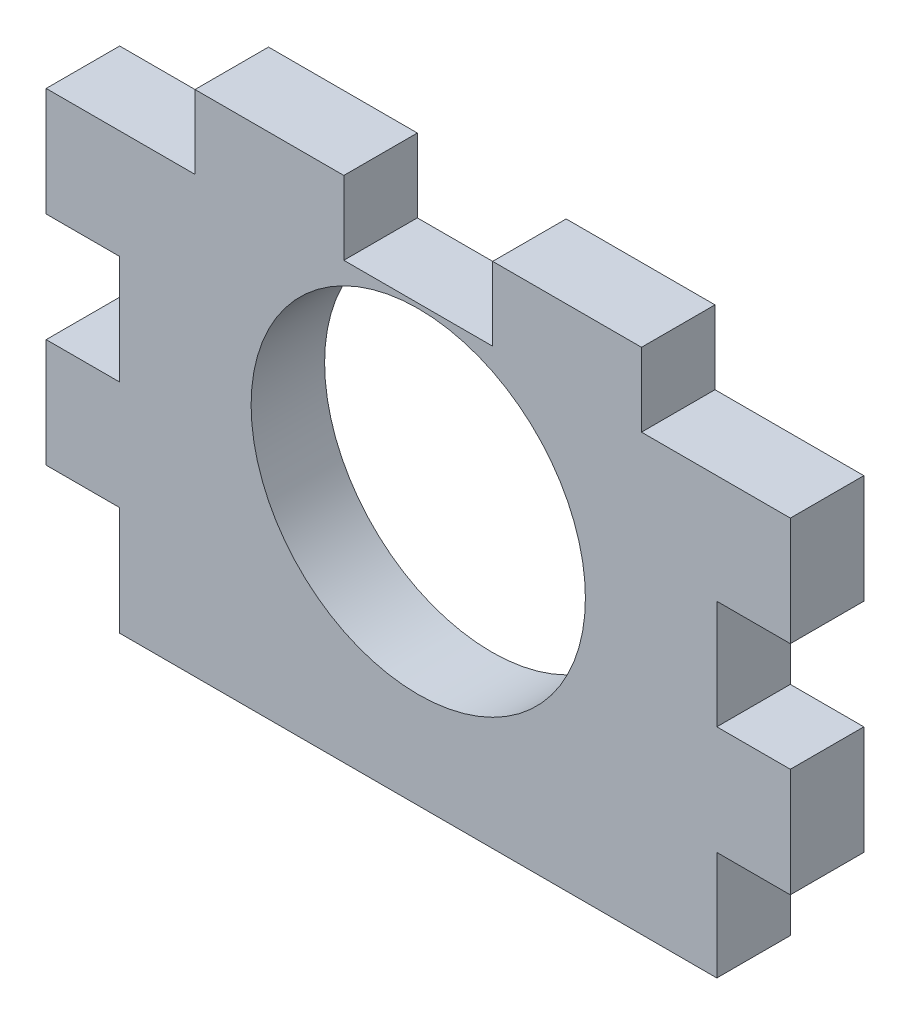
ISO-10303-21;
HEADER;
FILE_DESCRIPTION(('STEP AP214'),'2;1');
FILE_NAME('part.step','',(''),(''),'','','');
FILE_SCHEMA(('AUTOMOTIVE_DESIGN { 1 0 10303 214 1 1 1 1 }'));
ENDSEC;
DATA;
#1=APPLICATION_CONTEXT('core data for automotive mechanical design processes');
#2=APPLICATION_PROTOCOL_DEFINITION('international standard','automotive_design',2000,#1);
#3=PRODUCT_CONTEXT('',#1,'mechanical');
#4=PRODUCT('Part','Part','',(#3));
#5=PRODUCT_RELATED_PRODUCT_CATEGORY('part','',(#4));
#6=PRODUCT_DEFINITION_FORMATION('','',#4);
#7=PRODUCT_DEFINITION_CONTEXT('part definition',#1,'design');
#8=PRODUCT_DEFINITION('design','',#6,#7);
#9=PRODUCT_DEFINITION_SHAPE('','',#8);
#10=(LENGTH_UNIT() NAMED_UNIT(*) SI_UNIT(.MILLI.,.METRE.));
#11=(NAMED_UNIT(*) PLANE_ANGLE_UNIT() SI_UNIT($,.RADIAN.));
#12=(NAMED_UNIT(*) SI_UNIT($,.STERADIAN.) SOLID_ANGLE_UNIT());
#13=UNCERTAINTY_MEASURE_WITH_UNIT(LENGTH_MEASURE(1.E-05),#10,'distance_accuracy_value','');
#14=(GEOMETRIC_REPRESENTATION_CONTEXT(3) GLOBAL_UNCERTAINTY_ASSIGNED_CONTEXT((#13)) GLOBAL_UNIT_ASSIGNED_CONTEXT((#10,
#11,#12)) REPRESENTATION_CONTEXT('',''));
#15=CARTESIAN_POINT('',(0.,0.,0.));
#16=DIRECTION('',(0.,0.,1.));
#17=DIRECTION('',(1.,0.,0.));
#18=AXIS2_PLACEMENT_3D('',#15,#16,#17);
#19=CARTESIAN_POINT('',(-5.53524932452526,14.1108572179902,8.1534));
#20=DIRECTION('',(-1.,0.,0.));
#21=DIRECTION('',(0.,0.,1.));
#22=AXIS2_PLACEMENT_3D('',#19,#20,#21);
#23=PLANE('',#22);
#24=DIRECTION('',(0.,1.,0.));
#25=VECTOR('',#24,1.);
#26=CARTESIAN_POINT('',(-5.53524932452526,14.1108572179902,8.1534));
#27=LINE('',#26,#25);
#28=CARTESIAN_POINT('',(-5.53524932452527,-6.10722193706049,8.1534));
#29=VERTEX_POINT('',#28);
#30=CARTESIAN_POINT('',(-5.53524932452526,5.95745721799016,8.1534));
#31=VERTEX_POINT('',#30);
#32=EDGE_CURVE('E367',#29,#31,#27,.T.);
#33=ORIENTED_EDGE('',*,*,#32,.F.);
#34=DIRECTION('',(0.,0.,1.));
#35=VECTOR('',#34,1.);
#36=CARTESIAN_POINT('',(-5.53524932452527,-6.10722193706049,0.));
#37=LINE('',#36,#35);
#38=CARTESIAN_POINT('',(-5.53524932452527,-6.10722193706049,0.));
#39=VERTEX_POINT('',#38);
#40=EDGE_CURVE('E228',#39,#29,#37,.T.);
#41=ORIENTED_EDGE('',*,*,#40,.F.);
#42=DIRECTION('',(0.,1.,0.));
#43=VECTOR('',#42,1.);
#44=CARTESIAN_POINT('',(-5.53524932452526,14.1108572179902,0.));
#45=LINE('',#44,#43);
#46=CARTESIAN_POINT('',(-5.53524932452526,5.95745721799016,0.));
#47=VERTEX_POINT('',#46);
#48=EDGE_CURVE('E215',#39,#47,#45,.T.);
#49=ORIENTED_EDGE('',*,*,#48,.T.);
#50=DIRECTION('',(0.,0.,1.));
#51=VECTOR('',#50,1.);
#52=CARTESIAN_POINT('',(-5.53524932452526,5.95745721799016,0.));
#53=LINE('',#52,#51);
#54=EDGE_CURVE('E310',#47,#31,#53,.T.);
#55=ORIENTED_EDGE('',*,*,#54,.T.);
#56=EDGE_LOOP('',(#33,#41,#49,#55));
#57=FACE_BOUND('',#56,.T.);
#58=ADVANCED_FACE('F33',(#57),#23,.F.);
#59=CARTESIAN_POINT('',(-88.0852493245253,14.1108572179902,8.1534));
#60=DIRECTION('',(1.,0.,0.));
#61=DIRECTION('',(0.,0.,-1.));
#62=AXIS2_PLACEMENT_3D('',#59,#60,#61);
#63=PLANE('',#62);
#64=DIRECTION('',(0.,-1.,0.));
#65=VECTOR('',#64,1.);
#66=CARTESIAN_POINT('',(-88.0852493245253,14.1108572179902,0.));
#67=LINE('',#66,#65);
#68=CARTESIAN_POINT('',(-88.0852493245253,5.95745721799016,0.));
#69=VERTEX_POINT('',#68);
#70=CARTESIAN_POINT('',(-88.0852493245253,-6.1072219370605,0.));
#71=VERTEX_POINT('',#70);
#72=EDGE_CURVE('E371',#69,#71,#67,.T.);
#73=ORIENTED_EDGE('',*,*,#72,.T.);
#74=DIRECTION('',(0.,0.,1.));
#75=VECTOR('',#74,1.);
#76=CARTESIAN_POINT('',(-88.0852493245253,-6.1072219370605,0.));
#77=LINE('',#76,#75);
#78=CARTESIAN_POINT('',(-88.0852493245253,-6.1072219370605,8.1534));
#79=VERTEX_POINT('',#78);
#80=EDGE_CURVE('E268',#71,#79,#77,.T.);
#81=ORIENTED_EDGE('',*,*,#80,.T.);
#82=DIRECTION('',(0.,-1.,0.));
#83=VECTOR('',#82,1.);
#84=CARTESIAN_POINT('',(-88.0852493245253,14.1108572179902,8.1534));
#85=LINE('',#84,#83);
#86=CARTESIAN_POINT('',(-88.0852493245253,5.95745721799016,8.1534));
#87=VERTEX_POINT('',#86);
#88=EDGE_CURVE('E360',#87,#79,#85,.T.);
#89=ORIENTED_EDGE('',*,*,#88,.F.);
#90=DIRECTION('',(0.,0.,1.));
#91=VECTOR('',#90,1.);
#92=CARTESIAN_POINT('',(-88.0852493245253,5.95745721799016,0.));
#93=LINE('',#92,#91);
#94=EDGE_CURVE('E348',#69,#87,#93,.T.);
#95=ORIENTED_EDGE('',*,*,#94,.F.);
#96=EDGE_LOOP('',(#73,#81,#89,#95));
#97=FACE_BOUND('',#96,.T.);
#98=ADVANCED_FACE('F427',(#97),#63,.F.);
#99=CARTESIAN_POINT('',(-88.0852493245253,14.1108572179902,8.1534));
#100=DIRECTION('',(0.,-1.,0.));
#101=DIRECTION('',(0.,0.,-1.));
#102=AXIS2_PLACEMENT_3D('',#99,#100,#101);
#103=PLANE('',#102);
#104=DIRECTION('',(-1.,0.,0.));
#105=VECTOR('',#104,1.);
#106=CARTESIAN_POINT('',(-88.0852493245253,14.1108572179902,8.1534));
#107=LINE('',#106,#105);
#108=CARTESIAN_POINT('',(-55.0652493245253,14.1108572179902,8.1534));
#109=VERTEX_POINT('',#108);
#110=CARTESIAN_POINT('',(-71.5752493245253,14.1108572179902,8.1534));
#111=VERTEX_POINT('',#110);
#112=EDGE_CURVE('E42',#109,#111,#107,.T.);
#113=ORIENTED_EDGE('',*,*,#112,.F.);
#114=DIRECTION('',(0.,0.,1.));
#115=VECTOR('',#114,1.);
#116=CARTESIAN_POINT('',(-55.0652493245253,14.1108572179902,0.));
#117=LINE('',#116,#115);
#118=CARTESIAN_POINT('',(-55.0652493245253,14.1108572179902,0.));
#119=VERTEX_POINT('',#118);
#120=EDGE_CURVE('E332',#119,#109,#117,.T.);
#121=ORIENTED_EDGE('',*,*,#120,.F.);
#122=DIRECTION('',(-1.,0.,0.));
#123=VECTOR('',#122,1.);
#124=CARTESIAN_POINT('',(-88.0852493245253,14.1108572179902,0.));
#125=LINE('',#124,#123);
#126=CARTESIAN_POINT('',(-71.5752493245253,14.1108572179902,0.));
#127=VERTEX_POINT('',#126);
#128=EDGE_CURVE('E378',#119,#127,#125,.T.);
#129=ORIENTED_EDGE('',*,*,#128,.T.);
#130=DIRECTION('',(0.,0.,1.));
#131=VECTOR('',#130,1.);
#132=CARTESIAN_POINT('',(-71.5752493245253,14.1108572179902,0.));
#133=LINE('',#132,#131);
#134=EDGE_CURVE('E353',#127,#111,#133,.T.);
#135=ORIENTED_EDGE('',*,*,#134,.T.);
#136=EDGE_LOOP('',(#113,#121,#129,#135));
#137=FACE_BOUND('',#136,.T.);
#138=ADVANCED_FACE('F414',(#137),#103,.F.);
#139=CARTESIAN_POINT('',(-88.0852493245253,-18.1723288853769,8.1534));
#140=VERTEX_POINT('',#139);
#141=CARTESIAN_POINT('',(-88.0852493245253,-30.2374358336934,8.1534));
#142=VERTEX_POINT('',#141);
#143=EDGE_CURVE('E364',#140,#142,#85,.T.);
#144=ORIENTED_EDGE('',*,*,#143,.F.);
#145=DIRECTION('',(0.,0.,1.));
#146=VECTOR('',#145,1.);
#147=CARTESIAN_POINT('',(-88.0852493245253,-18.1723288853769,0.));
#148=LINE('',#147,#146);
#149=CARTESIAN_POINT('',(-88.0852493245253,-18.1723288853769,0.));
#150=VERTEX_POINT('',#149);
#151=EDGE_CURVE('E261',#150,#140,#148,.T.);
#152=ORIENTED_EDGE('',*,*,#151,.F.);
#153=CARTESIAN_POINT('',(-88.0852493245253,-30.2374358336934,0.));
#154=VERTEX_POINT('',#153);
#155=EDGE_CURVE('E356',#150,#154,#67,.T.);
#156=ORIENTED_EDGE('',*,*,#155,.T.);
#157=DIRECTION('',(0.,0.,1.));
#158=VECTOR('',#157,1.);
#159=CARTESIAN_POINT('',(-88.0852493245253,-30.2374358336934,0.));
#160=LINE('',#159,#158);
#161=EDGE_CURVE('E289',#154,#142,#160,.T.);
#162=ORIENTED_EDGE('',*,*,#161,.T.);
#163=EDGE_LOOP('',(#144,#152,#156,#162));
#164=FACE_BOUND('',#163,.T.);
#165=ADVANCED_FACE('F35',(#164),#63,.F.);
#166=CARTESIAN_POINT('',(-88.0852493245253,-42.3025427820098,8.1534));
#167=DIRECTION('',(0.,1.,0.));
#168=DIRECTION('',(0.,0.,1.));
#169=AXIS2_PLACEMENT_3D('',#166,#167,#168);
#170=PLANE('',#169);
#171=DIRECTION('',(1.,0.,0.));
#172=VECTOR('',#171,1.);
#173=CARTESIAN_POINT('',(-88.0852493245253,-42.3025427820098,0.));
#174=LINE('',#173,#172);
#175=CARTESIAN_POINT('',(-79.9318493245253,-42.3025427820098,0.));
#176=VERTEX_POINT('',#175);
#177=CARTESIAN_POINT('',(-13.6886493245253,-42.3025427820098,0.));
#178=VERTEX_POINT('',#177);
#179=EDGE_CURVE('E374',#176,#178,#174,.T.);
#180=ORIENTED_EDGE('',*,*,#179,.T.);
#181=DIRECTION('',(0.,0.,1.));
#182=VECTOR('',#181,1.);
#183=CARTESIAN_POINT('',(-13.6886493245253,-42.3025427820098,0.));
#184=LINE('',#183,#182);
#185=CARTESIAN_POINT('',(-13.6886493245253,-42.3025427820098,8.1534));
#186=VERTEX_POINT('',#185);
#187=EDGE_CURVE('E244',#178,#186,#184,.T.);
#188=ORIENTED_EDGE('',*,*,#187,.T.);
#189=DIRECTION('',(1.,0.,0.));
#190=VECTOR('',#189,1.);
#191=CARTESIAN_POINT('',(-88.0852493245253,-42.3025427820098,8.1534));
#192=LINE('',#191,#190);
#193=CARTESIAN_POINT('',(-79.9318493245253,-42.3025427820098,8.1534));
#194=VERTEX_POINT('',#193);
#195=EDGE_CURVE('E363',#194,#186,#192,.T.);
#196=ORIENTED_EDGE('',*,*,#195,.F.);
#197=DIRECTION('',(0.,0.,1.));
#198=VECTOR('',#197,1.);
#199=CARTESIAN_POINT('',(-79.9318493245253,-42.3025427820098,0.));
#200=LINE('',#199,#198);
#201=EDGE_CURVE('E284',#176,#194,#200,.T.);
#202=ORIENTED_EDGE('',*,*,#201,.F.);
#203=EDGE_LOOP('',(#180,#188,#196,#202));
#204=FACE_BOUND('',#203,.T.);
#205=ADVANCED_FACE('F455',(#204),#170,.F.);
#206=CARTESIAN_POINT('',(-5.53524932452526,-30.2374358336934,0.));
#207=VERTEX_POINT('',#206);
#208=CARTESIAN_POINT('',(-5.53524932452527,-18.1723288853769,0.));
#209=VERTEX_POINT('',#208);
#210=EDGE_CURVE('E376',#207,#209,#45,.T.);
#211=ORIENTED_EDGE('',*,*,#210,.T.);
#212=DIRECTION('',(0.,0.,1.));
#213=VECTOR('',#212,1.);
#214=CARTESIAN_POINT('',(-5.53524932452527,-18.1723288853769,0.));
#215=LINE('',#214,#213);
#216=CARTESIAN_POINT('',(-5.53524932452527,-18.1723288853769,8.1534));
#217=VERTEX_POINT('',#216);
#218=EDGE_CURVE('E231',#209,#217,#215,.T.);
#219=ORIENTED_EDGE('',*,*,#218,.T.);
#220=CARTESIAN_POINT('',(-5.53524932452526,-30.2374358336934,8.1534));
#221=VERTEX_POINT('',#220);
#222=EDGE_CURVE('E368',#221,#217,#27,.T.);
#223=ORIENTED_EDGE('',*,*,#222,.F.);
#224=DIRECTION('',(0.,0.,1.));
#225=VECTOR('',#224,1.);
#226=CARTESIAN_POINT('',(-5.53524932452526,-30.2374358336934,0.));
#227=LINE('',#226,#225);
#228=EDGE_CURVE('E240',#207,#221,#227,.T.);
#229=ORIENTED_EDGE('',*,*,#228,.F.);
#230=EDGE_LOOP('',(#211,#219,#223,#229));
#231=FACE_BOUND('',#230,.T.);
#232=ADVANCED_FACE('F462',(#231),#23,.F.);
#233=CARTESIAN_POINT('',(-22.0452493245253,14.1108572179902,8.1534));
#234=VERTEX_POINT('',#233);
#235=CARTESIAN_POINT('',(-38.5552493245253,14.1108572179902,8.1534));
#236=VERTEX_POINT('',#235);
#237=EDGE_CURVE('E11',#234,#236,#107,.T.);
#238=ORIENTED_EDGE('',*,*,#237,.F.);
#239=DIRECTION('',(0.,0.,1.));
#240=VECTOR('',#239,1.);
#241=CARTESIAN_POINT('',(-22.0452493245253,14.1108572179902,0.));
#242=LINE('',#241,#240);
#243=CARTESIAN_POINT('',(-22.0452493245253,14.1108572179902,0.));
#244=VERTEX_POINT('',#243);
#245=EDGE_CURVE('E307',#244,#234,#242,.T.);
#246=ORIENTED_EDGE('',*,*,#245,.F.);
#247=CARTESIAN_POINT('',(-38.5552493245253,14.1108572179902,0.));
#248=VERTEX_POINT('',#247);
#249=EDGE_CURVE('E37',#244,#248,#125,.T.);
#250=ORIENTED_EDGE('',*,*,#249,.T.);
#251=DIRECTION('',(0.,0.,1.));
#252=VECTOR('',#251,1.);
#253=CARTESIAN_POINT('',(-38.5552493245253,14.1108572179902,0.));
#254=LINE('',#253,#252);
#255=EDGE_CURVE('E335',#248,#236,#254,.T.);
#256=ORIENTED_EDGE('',*,*,#255,.T.);
#257=EDGE_LOOP('',(#238,#246,#250,#256));
#258=FACE_BOUND('',#257,.T.);
#259=ADVANCED_FACE('F396',(#258),#103,.F.);
#260=CARTESIAN_POINT('',(0.,0.,8.1534));
#261=DIRECTION('',(0.,0.,1.));
#262=DIRECTION('',(1.,0.,0.));
#263=AXIS2_PLACEMENT_3D('',#260,#261,#262);
#264=PLANE('',#263);
#265=CARTESIAN_POINT('',(-46.8102493245253,-13.0925427820098,8.1534));
#266=DIRECTION('',(0.,0.,-1.));
#267=DIRECTION('',(-1.,0.,0.));
#268=AXIS2_PLACEMENT_3D('',#265,#266,#267);
#269=CIRCLE('',#268,18.5419999999999);
#270=CARTESIAN_POINT('',(-65.3522493245252,-13.0925427820098,8.1534));
#271=VERTEX_POINT('',#270);
#272=EDGE_CURVE('E226',#271,#271,#269,.T.);
#273=ORIENTED_EDGE('',*,*,#272,.T.);
#274=EDGE_LOOP('',(#273));
#275=FACE_BOUND('',#274,.T.);
#276=DIRECTION('',(-1.,0.,0.));
#277=VECTOR('',#276,1.);
#278=CARTESIAN_POINT('',(-5.53524932452527,-6.10722193706049,8.1534));
#279=LINE('',#278,#277);
#280=CARTESIAN_POINT('',(-13.6886493245253,-6.10722193706049,8.1534));
#281=VERTEX_POINT('',#280);
#282=EDGE_CURVE('E201',#29,#281,#279,.T.);
#283=ORIENTED_EDGE('',*,*,#282,.F.);
#284=ORIENTED_EDGE('',*,*,#32,.T.);
#285=DIRECTION('',(1.,0.,0.));
#286=VECTOR('',#285,1.);
#287=CARTESIAN_POINT('',(-22.0452493245253,5.95745721799016,8.1534));
#288=LINE('',#287,#286);
#289=CARTESIAN_POINT('',(-22.0452493245253,5.95745721799016,8.1534));
#290=VERTEX_POINT('',#289);
#291=EDGE_CURVE('E300',#290,#31,#288,.T.);
#292=ORIENTED_EDGE('',*,*,#291,.F.);
#293=DIRECTION('',(0.,-1.,0.));
#294=VECTOR('',#293,1.);
#295=CARTESIAN_POINT('',(-22.0452493245253,14.1108572179902,8.1534));
#296=LINE('',#295,#294);
#297=EDGE_CURVE('E292',#234,#290,#296,.T.);
#298=ORIENTED_EDGE('',*,*,#297,.F.);
#299=ORIENTED_EDGE('',*,*,#237,.T.);
#300=DIRECTION('',(0.,1.,0.));
#301=VECTOR('',#300,1.);
#302=CARTESIAN_POINT('',(-38.5552493245253,14.1108572179902,8.1534));
#303=LINE('',#302,#301);
#304=CARTESIAN_POINT('',(-38.5552493245253,5.95745721799016,8.1534));
#305=VERTEX_POINT('',#304);
#306=EDGE_CURVE('E318',#305,#236,#303,.T.);
#307=ORIENTED_EDGE('',*,*,#306,.F.);
#308=DIRECTION('',(1.,0.,0.));
#309=VECTOR('',#308,1.);
#310=CARTESIAN_POINT('',(-55.0652493245253,5.95745721799016,8.1534));
#311=LINE('',#310,#309);
#312=CARTESIAN_POINT('',(-55.0652493245253,5.95745721799016,8.1534));
#313=VERTEX_POINT('',#312);
#314=EDGE_CURVE('E327',#313,#305,#311,.T.);
#315=ORIENTED_EDGE('',*,*,#314,.F.);
#316=DIRECTION('',(0.,-1.,0.));
#317=VECTOR('',#316,1.);
#318=CARTESIAN_POINT('',(-55.0652493245253,14.1108572179902,8.1534));
#319=LINE('',#318,#317);
#320=EDGE_CURVE('E309',#109,#313,#319,.T.);
#321=ORIENTED_EDGE('',*,*,#320,.F.);
#322=ORIENTED_EDGE('',*,*,#112,.T.);
#323=DIRECTION('',(0.,1.,0.));
#324=VECTOR('',#323,1.);
#325=CARTESIAN_POINT('',(-71.5752493245253,14.1108572179902,8.1534));
#326=LINE('',#325,#324);
#327=CARTESIAN_POINT('',(-71.5752493245253,5.95745721799016,8.1534));
#328=VERTEX_POINT('',#327);
#329=EDGE_CURVE('E345',#328,#111,#326,.T.);
#330=ORIENTED_EDGE('',*,*,#329,.F.);
#331=DIRECTION('',(1.,0.,0.));
#332=VECTOR('',#331,1.);
#333=CARTESIAN_POINT('',(-88.0852493245253,5.95745721799016,8.1534));
#334=LINE('',#333,#332);
#335=EDGE_CURVE('E334',#87,#328,#334,.T.);
#336=ORIENTED_EDGE('',*,*,#335,.F.);
#337=ORIENTED_EDGE('',*,*,#88,.T.);
#338=DIRECTION('',(-1.,0.,0.));
#339=VECTOR('',#338,1.);
#340=CARTESIAN_POINT('',(-88.0852493245253,-6.1072219370605,8.1534));
#341=LINE('',#340,#339);
#342=CARTESIAN_POINT('',(-79.9318493245253,-6.1072219370605,8.1534));
#343=VERTEX_POINT('',#342);
#344=EDGE_CURVE('E255',#343,#79,#341,.T.);
#345=ORIENTED_EDGE('',*,*,#344,.F.);
#346=DIRECTION('',(0.,1.,0.));
#347=VECTOR('',#346,1.);
#348=CARTESIAN_POINT('',(-79.9318493245253,-6.1072219370605,8.1534));
#349=LINE('',#348,#347);
#350=CARTESIAN_POINT('',(-79.9318493245253,-18.1723288853769,8.1534));
#351=VERTEX_POINT('',#350);
#352=EDGE_CURVE('E264',#351,#343,#349,.T.);
#353=ORIENTED_EDGE('',*,*,#352,.F.);
#354=DIRECTION('',(1.,0.,0.));
#355=VECTOR('',#354,1.);
#356=CARTESIAN_POINT('',(-88.0852493245253,-18.1723288853769,8.1534));
#357=LINE('',#356,#355);
#358=EDGE_CURVE('E247',#140,#351,#357,.T.);
#359=ORIENTED_EDGE('',*,*,#358,.F.);
#360=ORIENTED_EDGE('',*,*,#143,.T.);
#361=DIRECTION('',(-1.,0.,0.));
#362=VECTOR('',#361,1.);
#363=CARTESIAN_POINT('',(-88.0852493245253,-30.2374358336934,8.1534));
#364=LINE('',#363,#362);
#365=CARTESIAN_POINT('',(-79.9318493245253,-30.2374358336934,8.1534));
#366=VERTEX_POINT('',#365);
#367=EDGE_CURVE('E281',#366,#142,#364,.T.);
#368=ORIENTED_EDGE('',*,*,#367,.F.);
#369=DIRECTION('',(0.,1.,0.));
#370=VECTOR('',#369,1.);
#371=CARTESIAN_POINT('',(-79.9318493245253,-42.3025427820098,8.1534));
#372=LINE('',#371,#370);
#373=EDGE_CURVE('E271',#194,#366,#372,.T.);
#374=ORIENTED_EDGE('',*,*,#373,.F.);
#375=ORIENTED_EDGE('',*,*,#195,.T.);
#376=DIRECTION('',(0.,-1.,0.));
#377=VECTOR('',#376,1.);
#378=CARTESIAN_POINT('',(-13.6886493245253,-42.3025427820098,8.1534));
#379=LINE('',#378,#377);
#380=CARTESIAN_POINT('',(-13.6886493245253,-30.2374358336934,8.1534));
#381=VERTEX_POINT('',#380);
#382=EDGE_CURVE('E238',#381,#186,#379,.T.);
#383=ORIENTED_EDGE('',*,*,#382,.F.);
#384=DIRECTION('',(-1.,0.,0.));
#385=VECTOR('',#384,1.);
#386=CARTESIAN_POINT('',(-5.53524932452526,-30.2374358336934,8.1534));
#387=LINE('',#386,#385);
#388=EDGE_CURVE('E230',#221,#381,#387,.T.);
#389=ORIENTED_EDGE('',*,*,#388,.F.);
#390=ORIENTED_EDGE('',*,*,#222,.T.);
#391=DIRECTION('',(1.,0.,0.));
#392=VECTOR('',#391,1.);
#393=CARTESIAN_POINT('',(-5.53524932452527,-18.1723288853769,8.1534));
#394=LINE('',#393,#392);
#395=CARTESIAN_POINT('',(-13.6886493245253,-18.1723288853769,8.1534));
#396=VERTEX_POINT('',#395);
#397=EDGE_CURVE('E216',#396,#217,#394,.T.);
#398=ORIENTED_EDGE('',*,*,#397,.F.);
#399=DIRECTION('',(0.,-1.,0.));
#400=VECTOR('',#399,1.);
#401=CARTESIAN_POINT('',(-13.6886493245253,-6.10722193706049,8.1534));
#402=LINE('',#401,#400);
#403=EDGE_CURVE('E218',#281,#396,#402,.T.);
#404=ORIENTED_EDGE('',*,*,#403,.F.);
#405=EDGE_LOOP('',(#283,#284,#292,#298,#299,#307,#315,#321,#322,#330,#336,#337,#345,#353,#359,
#360,#368,#374,#375,#383,#389,#390,#398,#404));
#406=FACE_BOUND('',#405,.T.);
#407=ADVANCED_FACE('F400',(#275,#406),#264,.T.);
#408=CARTESIAN_POINT('',(0.,0.,0.));
#409=DIRECTION('',(0.,0.,1.));
#410=DIRECTION('',(1.,0.,0.));
#411=AXIS2_PLACEMENT_3D('',#408,#409,#410);
#412=PLANE('',#411);
#413=CARTESIAN_POINT('',(-46.8102493245253,-13.0925427820098,0.));
#414=DIRECTION('',(0.,0.,-1.));
#415=DIRECTION('',(-1.,0.,0.));
#416=AXIS2_PLACEMENT_3D('',#413,#414,#415);
#417=CIRCLE('',#416,18.5419999999999);
#418=CARTESIAN_POINT('',(-65.3522493245252,-13.0925427820098,0.));
#419=VERTEX_POINT('',#418);
#420=EDGE_CURVE('E221',#419,#419,#417,.T.);
#421=ORIENTED_EDGE('',*,*,#420,.F.);
#422=EDGE_LOOP('',(#421));
#423=FACE_BOUND('',#422,.T.);
#424=ORIENTED_EDGE('',*,*,#48,.F.);
#425=DIRECTION('',(-1.,0.,0.));
#426=VECTOR('',#425,1.);
#427=CARTESIAN_POINT('',(-5.53524932452527,-6.10722193706049,0.));
#428=LINE('',#427,#426);
#429=CARTESIAN_POINT('',(-13.6886493245253,-6.10722193706049,0.));
#430=VERTEX_POINT('',#429);
#431=EDGE_CURVE('E198',#39,#430,#428,.T.);
#432=ORIENTED_EDGE('',*,*,#431,.T.);
#433=DIRECTION('',(0.,-1.,0.));
#434=VECTOR('',#433,1.);
#435=CARTESIAN_POINT('',(-13.6886493245253,-6.10722193706049,0.));
#436=LINE('',#435,#434);
#437=CARTESIAN_POINT('',(-13.6886493245253,-18.1723288853769,0.));
#438=VERTEX_POINT('',#437);
#439=EDGE_CURVE('E208',#430,#438,#436,.T.);
#440=ORIENTED_EDGE('',*,*,#439,.T.);
#441=DIRECTION('',(1.,0.,0.));
#442=VECTOR('',#441,1.);
#443=CARTESIAN_POINT('',(-5.53524932452527,-18.1723288853769,0.));
#444=LINE('',#443,#442);
#445=EDGE_CURVE('E50',#438,#209,#444,.T.);
#446=ORIENTED_EDGE('',*,*,#445,.T.);
#447=ORIENTED_EDGE('',*,*,#210,.F.);
#448=DIRECTION('',(-1.,0.,0.));
#449=VECTOR('',#448,1.);
#450=CARTESIAN_POINT('',(-5.53524932452526,-30.2374358336934,0.));
#451=LINE('',#450,#449);
#452=CARTESIAN_POINT('',(-13.6886493245253,-30.2374358336934,0.));
#453=VERTEX_POINT('',#452);
#454=EDGE_CURVE('E235',#207,#453,#451,.T.);
#455=ORIENTED_EDGE('',*,*,#454,.T.);
#456=DIRECTION('',(0.,-1.,0.));
#457=VECTOR('',#456,1.);
#458=CARTESIAN_POINT('',(-13.6886493245253,-42.3025427820098,0.));
#459=LINE('',#458,#457);
#460=EDGE_CURVE('E58',#453,#178,#459,.T.);
#461=ORIENTED_EDGE('',*,*,#460,.T.);
#462=ORIENTED_EDGE('',*,*,#179,.F.);
#463=DIRECTION('',(0.,1.,0.));
#464=VECTOR('',#463,1.);
#465=CARTESIAN_POINT('',(-79.9318493245253,-42.3025427820098,0.));
#466=LINE('',#465,#464);
#467=CARTESIAN_POINT('',(-79.9318493245253,-30.2374358336934,0.));
#468=VERTEX_POINT('',#467);
#469=EDGE_CURVE('E277',#176,#468,#466,.T.);
#470=ORIENTED_EDGE('',*,*,#469,.T.);
#471=DIRECTION('',(-1.,0.,0.));
#472=VECTOR('',#471,1.);
#473=CARTESIAN_POINT('',(-88.0852493245253,-30.2374358336934,0.));
#474=LINE('',#473,#472);
#475=EDGE_CURVE('E280',#468,#154,#474,.T.);
#476=ORIENTED_EDGE('',*,*,#475,.T.);
#477=ORIENTED_EDGE('',*,*,#155,.F.);
#478=DIRECTION('',(1.,0.,0.));
#479=VECTOR('',#478,1.);
#480=CARTESIAN_POINT('',(-88.0852493245253,-18.1723288853769,0.));
#481=LINE('',#480,#479);
#482=CARTESIAN_POINT('',(-79.9318493245253,-18.1723288853769,0.));
#483=VERTEX_POINT('',#482);
#484=EDGE_CURVE('E251',#150,#483,#481,.T.);
#485=ORIENTED_EDGE('',*,*,#484,.T.);
#486=DIRECTION('',(0.,1.,0.));
#487=VECTOR('',#486,1.);
#488=CARTESIAN_POINT('',(-79.9318493245253,-6.1072219370605,0.));
#489=LINE('',#488,#487);
#490=CARTESIAN_POINT('',(-79.9318493245253,-6.1072219370605,0.));
#491=VERTEX_POINT('',#490);
#492=EDGE_CURVE('E254',#483,#491,#489,.T.);
#493=ORIENTED_EDGE('',*,*,#492,.T.);
#494=DIRECTION('',(-1.,0.,0.));
#495=VECTOR('',#494,1.);
#496=CARTESIAN_POINT('',(-88.0852493245253,-6.1072219370605,0.));
#497=LINE('',#496,#495);
#498=EDGE_CURVE('E258',#491,#71,#497,.T.);
#499=ORIENTED_EDGE('',*,*,#498,.T.);
#500=ORIENTED_EDGE('',*,*,#72,.F.);
#501=DIRECTION('',(1.,0.,0.));
#502=VECTOR('',#501,1.);
#503=CARTESIAN_POINT('',(-88.0852493245253,5.95745721799016,0.));
#504=LINE('',#503,#502);
#505=CARTESIAN_POINT('',(-71.5752493245253,5.95745721799016,0.));
#506=VERTEX_POINT('',#505);
#507=EDGE_CURVE('E341',#69,#506,#504,.T.);
#508=ORIENTED_EDGE('',*,*,#507,.T.);
#509=DIRECTION('',(0.,1.,0.));
#510=VECTOR('',#509,1.);
#511=CARTESIAN_POINT('',(-71.5752493245253,14.1108572179902,0.));
#512=LINE('',#511,#510);
#513=EDGE_CURVE('E344',#506,#127,#512,.T.);
#514=ORIENTED_EDGE('',*,*,#513,.T.);
#515=ORIENTED_EDGE('',*,*,#128,.F.);
#516=DIRECTION('',(0.,-1.,0.));
#517=VECTOR('',#516,1.);
#518=CARTESIAN_POINT('',(-55.0652493245253,14.1108572179902,0.));
#519=LINE('',#518,#517);
#520=CARTESIAN_POINT('',(-55.0652493245253,5.95745721799016,0.));
#521=VERTEX_POINT('',#520);
#522=EDGE_CURVE('E314',#119,#521,#519,.T.);
#523=ORIENTED_EDGE('',*,*,#522,.T.);
#524=DIRECTION('',(1.,0.,0.));
#525=VECTOR('',#524,1.);
#526=CARTESIAN_POINT('',(-55.0652493245253,5.95745721799016,0.));
#527=LINE('',#526,#525);
#528=CARTESIAN_POINT('',(-38.5552493245253,5.95745721799016,0.));
#529=VERTEX_POINT('',#528);
#530=EDGE_CURVE('E317',#521,#529,#527,.T.);
#531=ORIENTED_EDGE('',*,*,#530,.T.);
#532=DIRECTION('',(0.,1.,0.));
#533=VECTOR('',#532,1.);
#534=CARTESIAN_POINT('',(-38.5552493245253,14.1108572179902,0.));
#535=LINE('',#534,#533);
#536=EDGE_CURVE('E321',#529,#248,#535,.T.);
#537=ORIENTED_EDGE('',*,*,#536,.T.);
#538=ORIENTED_EDGE('',*,*,#249,.F.);
#539=DIRECTION('',(0.,-1.,0.));
#540=VECTOR('',#539,1.);
#541=CARTESIAN_POINT('',(-22.0452493245253,14.1108572179902,0.));
#542=LINE('',#541,#540);
#543=CARTESIAN_POINT('',(-22.0452493245253,5.95745721799016,0.));
#544=VERTEX_POINT('',#543);
#545=EDGE_CURVE('E296',#244,#544,#542,.T.);
#546=ORIENTED_EDGE('',*,*,#545,.T.);
#547=DIRECTION('',(1.,0.,0.));
#548=VECTOR('',#547,1.);
#549=CARTESIAN_POINT('',(-22.0452493245253,5.95745721799016,0.));
#550=LINE('',#549,#548);
#551=EDGE_CURVE('E299',#544,#47,#550,.T.);
#552=ORIENTED_EDGE('',*,*,#551,.T.);
#553=EDGE_LOOP('',(#424,#432,#440,#446,#447,#455,#461,#462,#470,#476,#477,#485,#493,#499,#500,
#508,#514,#515,#523,#531,#537,#538,#546,#552));
#554=FACE_BOUND('',#553,.T.);
#555=ADVANCED_FACE('F213',(#423,#554),#412,.F.);
#556=CARTESIAN_POINT('',(-71.5752493245253,14.1108572179902,0.));
#557=DIRECTION('',(1.,0.,0.));
#558=DIRECTION('',(0.,0.,-1.));
#559=AXIS2_PLACEMENT_3D('',#556,#557,#558);
#560=PLANE('',#559);
#561=ORIENTED_EDGE('',*,*,#329,.T.);
#562=ORIENTED_EDGE('',*,*,#134,.F.);
#563=ORIENTED_EDGE('',*,*,#513,.F.);
#564=DIRECTION('',(0.,0.,1.));
#565=VECTOR('',#564,1.);
#566=CARTESIAN_POINT('',(-71.5752493245253,5.95745721799016,0.));
#567=LINE('',#566,#565);
#568=EDGE_CURVE('E357',#506,#328,#567,.T.);
#569=ORIENTED_EDGE('',*,*,#568,.T.);
#570=EDGE_LOOP('',(#561,#562,#563,#569));
#571=FACE_BOUND('',#570,.T.);
#572=ADVANCED_FACE('F418',(#571),#560,.F.);
#573=CARTESIAN_POINT('',(-88.0852493245253,5.95745721799016,0.));
#574=DIRECTION('',(0.,-1.,0.));
#575=DIRECTION('',(0.,0.,-1.));
#576=AXIS2_PLACEMENT_3D('',#573,#574,#575);
#577=PLANE('',#576);
#578=ORIENTED_EDGE('',*,*,#335,.T.);
#579=ORIENTED_EDGE('',*,*,#568,.F.);
#580=ORIENTED_EDGE('',*,*,#507,.F.);
#581=ORIENTED_EDGE('',*,*,#94,.T.);
#582=EDGE_LOOP('',(#578,#579,#580,#581));
#583=FACE_BOUND('',#582,.T.);
#584=ADVANCED_FACE('F423',(#583),#577,.F.);
#585=CARTESIAN_POINT('',(-55.0652493245253,14.1108572179902,0.));
#586=DIRECTION('',(-1.,0.,0.));
#587=DIRECTION('',(0.,0.,1.));
#588=AXIS2_PLACEMENT_3D('',#585,#586,#587);
#589=PLANE('',#588);
#590=ORIENTED_EDGE('',*,*,#320,.T.);
#591=DIRECTION('',(0.,0.,1.));
#592=VECTOR('',#591,1.);
#593=CARTESIAN_POINT('',(-55.0652493245253,5.95745721799016,0.));
#594=LINE('',#593,#592);
#595=EDGE_CURVE('E324',#521,#313,#594,.T.);
#596=ORIENTED_EDGE('',*,*,#595,.F.);
#597=ORIENTED_EDGE('',*,*,#522,.F.);
#598=ORIENTED_EDGE('',*,*,#120,.T.);
#599=EDGE_LOOP('',(#590,#596,#597,#598));
#600=FACE_BOUND('',#599,.T.);
#601=ADVANCED_FACE('F503',(#600),#589,.F.);
#602=CARTESIAN_POINT('',(-38.5552493245253,14.1108572179902,0.));
#603=DIRECTION('',(1.,0.,0.));
#604=DIRECTION('',(0.,0.,-1.));
#605=AXIS2_PLACEMENT_3D('',#602,#603,#604);
#606=PLANE('',#605);
#607=ORIENTED_EDGE('',*,*,#306,.T.);
#608=ORIENTED_EDGE('',*,*,#255,.F.);
#609=ORIENTED_EDGE('',*,*,#536,.F.);
#610=DIRECTION('',(0.,0.,1.));
#611=VECTOR('',#610,1.);
#612=CARTESIAN_POINT('',(-38.5552493245253,5.95745721799016,0.));
#613=LINE('',#612,#611);
#614=EDGE_CURVE('E338',#529,#305,#613,.T.);
#615=ORIENTED_EDGE('',*,*,#614,.T.);
#616=EDGE_LOOP('',(#607,#608,#609,#615));
#617=FACE_BOUND('',#616,.T.);
#618=ADVANCED_FACE('F403',(#617),#606,.F.);
#619=CARTESIAN_POINT('',(-55.0652493245253,5.95745721799016,0.));
#620=DIRECTION('',(0.,-1.,0.));
#621=DIRECTION('',(0.,0.,-1.));
#622=AXIS2_PLACEMENT_3D('',#619,#620,#621);
#623=PLANE('',#622);
#624=ORIENTED_EDGE('',*,*,#314,.T.);
#625=ORIENTED_EDGE('',*,*,#614,.F.);
#626=ORIENTED_EDGE('',*,*,#530,.F.);
#627=ORIENTED_EDGE('',*,*,#595,.T.);
#628=EDGE_LOOP('',(#624,#625,#626,#627));
#629=FACE_BOUND('',#628,.T.);
#630=ADVANCED_FACE('F407',(#629),#623,.F.);
#631=CARTESIAN_POINT('',(-22.0452493245253,14.1108572179902,0.));
#632=DIRECTION('',(-1.,0.,0.));
#633=DIRECTION('',(0.,0.,1.));
#634=AXIS2_PLACEMENT_3D('',#631,#632,#633);
#635=PLANE('',#634);
#636=ORIENTED_EDGE('',*,*,#297,.T.);
#637=DIRECTION('',(0.,0.,1.));
#638=VECTOR('',#637,1.);
#639=CARTESIAN_POINT('',(-22.0452493245253,5.95745721799016,0.));
#640=LINE('',#639,#638);
#641=EDGE_CURVE('E302',#544,#290,#640,.T.);
#642=ORIENTED_EDGE('',*,*,#641,.F.);
#643=ORIENTED_EDGE('',*,*,#545,.F.);
#644=ORIENTED_EDGE('',*,*,#245,.T.);
#645=EDGE_LOOP('',(#636,#642,#643,#644));
#646=FACE_BOUND('',#645,.T.);
#647=ADVANCED_FACE('F392',(#646),#635,.F.);
#648=CARTESIAN_POINT('',(-22.0452493245253,5.95745721799016,0.));
#649=DIRECTION('',(0.,-1.,0.));
#650=DIRECTION('',(0.,0.,-1.));
#651=AXIS2_PLACEMENT_3D('',#648,#649,#650);
#652=PLANE('',#651);
#653=ORIENTED_EDGE('',*,*,#291,.T.);
#654=ORIENTED_EDGE('',*,*,#54,.F.);
#655=ORIENTED_EDGE('',*,*,#551,.F.);
#656=ORIENTED_EDGE('',*,*,#641,.T.);
#657=EDGE_LOOP('',(#653,#654,#655,#656));
#658=FACE_BOUND('',#657,.T.);
#659=ADVANCED_FACE('F387',(#658),#652,.F.);
#660=CARTESIAN_POINT('',(-88.0852493245253,-30.2374358336934,0.));
#661=DIRECTION('',(0.,1.,0.));
#662=DIRECTION('',(0.,0.,1.));
#663=AXIS2_PLACEMENT_3D('',#660,#661,#662);
#664=PLANE('',#663);
#665=ORIENTED_EDGE('',*,*,#367,.T.);
#666=ORIENTED_EDGE('',*,*,#161,.F.);
#667=ORIENTED_EDGE('',*,*,#475,.F.);
#668=DIRECTION('',(0.,0.,1.));
#669=VECTOR('',#668,1.);
#670=CARTESIAN_POINT('',(-79.9318493245253,-30.2374358336934,0.));
#671=LINE('',#670,#669);
#672=EDGE_CURVE('E293',#468,#366,#671,.T.);
#673=ORIENTED_EDGE('',*,*,#672,.T.);
#674=EDGE_LOOP('',(#665,#666,#667,#673));
#675=FACE_BOUND('',#674,.T.);
#676=ADVANCED_FACE('F446',(#675),#664,.F.);
#677=CARTESIAN_POINT('',(-79.9318493245253,-42.3025427820098,0.));
#678=DIRECTION('',(1.,0.,0.));
#679=DIRECTION('',(0.,0.,-1.));
#680=AXIS2_PLACEMENT_3D('',#677,#678,#679);
#681=PLANE('',#680);
#682=ORIENTED_EDGE('',*,*,#373,.T.);
#683=ORIENTED_EDGE('',*,*,#672,.F.);
#684=ORIENTED_EDGE('',*,*,#469,.F.);
#685=ORIENTED_EDGE('',*,*,#201,.T.);
#686=EDGE_LOOP('',(#682,#683,#684,#685));
#687=FACE_BOUND('',#686,.T.);
#688=ADVANCED_FACE('F451',(#687),#681,.F.);
#689=CARTESIAN_POINT('',(-88.0852493245253,-6.1072219370605,0.));
#690=DIRECTION('',(0.,1.,0.));
#691=DIRECTION('',(-1.,0.,0.));
#692=AXIS2_PLACEMENT_3D('',#689,#690,#691);
#693=PLANE('',#692);
#694=ORIENTED_EDGE('',*,*,#344,.T.);
#695=ORIENTED_EDGE('',*,*,#80,.F.);
#696=ORIENTED_EDGE('',*,*,#498,.F.);
#697=DIRECTION('',(0.,0.,1.));
#698=VECTOR('',#697,1.);
#699=CARTESIAN_POINT('',(-79.9318493245253,-6.1072219370605,0.));
#700=LINE('',#699,#698);
#701=EDGE_CURVE('E272',#491,#343,#700,.T.);
#702=ORIENTED_EDGE('',*,*,#701,.T.);
#703=EDGE_LOOP('',(#694,#695,#696,#702));
#704=FACE_BOUND('',#703,.T.);
#705=ADVANCED_FACE('F432',(#704),#693,.F.);
#706=CARTESIAN_POINT('',(-79.9318493245253,-6.1072219370605,0.));
#707=DIRECTION('',(1.,0.,0.));
#708=DIRECTION('',(0.,0.,-1.));
#709=AXIS2_PLACEMENT_3D('',#706,#707,#708);
#710=PLANE('',#709);
#711=ORIENTED_EDGE('',*,*,#352,.T.);
#712=ORIENTED_EDGE('',*,*,#701,.F.);
#713=ORIENTED_EDGE('',*,*,#492,.F.);
#714=DIRECTION('',(0.,0.,1.));
#715=VECTOR('',#714,1.);
#716=CARTESIAN_POINT('',(-79.9318493245253,-18.1723288853769,0.));
#717=LINE('',#716,#715);
#718=EDGE_CURVE('E274',#483,#351,#717,.T.);
#719=ORIENTED_EDGE('',*,*,#718,.T.);
#720=EDGE_LOOP('',(#711,#712,#713,#719));
#721=FACE_BOUND('',#720,.T.);
#722=ADVANCED_FACE('F435',(#721),#710,.F.);
#723=CARTESIAN_POINT('',(-88.0852493245253,-18.1723288853769,0.));
#724=DIRECTION('',(0.,-1.,0.));
#725=DIRECTION('',(0.,0.,-1.));
#726=AXIS2_PLACEMENT_3D('',#723,#724,#725);
#727=PLANE('',#726);
#728=ORIENTED_EDGE('',*,*,#358,.T.);
#729=ORIENTED_EDGE('',*,*,#718,.F.);
#730=ORIENTED_EDGE('',*,*,#484,.F.);
#731=ORIENTED_EDGE('',*,*,#151,.T.);
#732=EDGE_LOOP('',(#728,#729,#730,#731));
#733=FACE_BOUND('',#732,.T.);
#734=ADVANCED_FACE('F438',(#733),#727,.F.);
#735=CARTESIAN_POINT('',(-13.6886493245253,-42.3025427820098,0.));
#736=DIRECTION('',(-1.,0.,0.));
#737=DIRECTION('',(0.,0.,1.));
#738=AXIS2_PLACEMENT_3D('',#735,#736,#737);
#739=PLANE('',#738);
#740=ORIENTED_EDGE('',*,*,#382,.T.);
#741=ORIENTED_EDGE('',*,*,#187,.F.);
#742=ORIENTED_EDGE('',*,*,#460,.F.);
#743=DIRECTION('',(0.,0.,1.));
#744=VECTOR('',#743,1.);
#745=CARTESIAN_POINT('',(-13.6886493245253,-30.2374358336934,0.));
#746=LINE('',#745,#744);
#747=EDGE_CURVE('E248',#453,#381,#746,.T.);
#748=ORIENTED_EDGE('',*,*,#747,.T.);
#749=EDGE_LOOP('',(#740,#741,#742,#748));
#750=FACE_BOUND('',#749,.T.);
#751=ADVANCED_FACE('F459',(#750),#739,.F.);
#752=CARTESIAN_POINT('',(-5.53524932452526,-30.2374358336934,0.));
#753=DIRECTION('',(0.,1.,0.));
#754=DIRECTION('',(-1.,0.,0.));
#755=AXIS2_PLACEMENT_3D('',#752,#753,#754);
#756=PLANE('',#755);
#757=ORIENTED_EDGE('',*,*,#388,.T.);
#758=ORIENTED_EDGE('',*,*,#747,.F.);
#759=ORIENTED_EDGE('',*,*,#454,.F.);
#760=ORIENTED_EDGE('',*,*,#228,.T.);
#761=EDGE_LOOP('',(#757,#758,#759,#760));
#762=FACE_BOUND('',#761,.T.);
#763=ADVANCED_FACE('F461',(#762),#756,.F.);
#764=CARTESIAN_POINT('',(-5.53524932452527,-6.10722193706049,0.));
#765=DIRECTION('',(0.,1.,0.));
#766=DIRECTION('',(-1.,0.,0.));
#767=AXIS2_PLACEMENT_3D('',#764,#765,#766);
#768=PLANE('',#767);
#769=ORIENTED_EDGE('',*,*,#282,.T.);
#770=DIRECTION('',(0.,0.,1.));
#771=VECTOR('',#770,1.);
#772=CARTESIAN_POINT('',(-13.6886493245253,-6.10722193706049,0.));
#773=LINE('',#772,#771);
#774=EDGE_CURVE('E194',#430,#281,#773,.T.);
#775=ORIENTED_EDGE('',*,*,#774,.F.);
#776=ORIENTED_EDGE('',*,*,#431,.F.);
#777=ORIENTED_EDGE('',*,*,#40,.T.);
#778=EDGE_LOOP('',(#769,#775,#776,#777));
#779=FACE_BOUND('',#778,.T.);
#780=ADVANCED_FACE('F196',(#779),#768,.F.);
#781=CARTESIAN_POINT('',(-5.53524932452527,-18.1723288853769,0.));
#782=DIRECTION('',(0.,-1.,0.));
#783=DIRECTION('',(1.,0.,0.));
#784=AXIS2_PLACEMENT_3D('',#781,#782,#783);
#785=PLANE('',#784);
#786=ORIENTED_EDGE('',*,*,#397,.T.);
#787=ORIENTED_EDGE('',*,*,#218,.F.);
#788=ORIENTED_EDGE('',*,*,#445,.F.);
#789=DIRECTION('',(0.,0.,1.));
#790=VECTOR('',#789,1.);
#791=CARTESIAN_POINT('',(-13.6886493245253,-18.1723288853769,0.));
#792=LINE('',#791,#790);
#793=EDGE_CURVE('E205',#438,#396,#792,.T.);
#794=ORIENTED_EDGE('',*,*,#793,.T.);
#795=EDGE_LOOP('',(#786,#787,#788,#794));
#796=FACE_BOUND('',#795,.T.);
#797=ADVANCED_FACE('F464',(#796),#785,.F.);
#798=CARTESIAN_POINT('',(-13.6886493245253,-6.10722193706049,0.));
#799=DIRECTION('',(-1.,0.,0.));
#800=DIRECTION('',(0.,0.,1.));
#801=AXIS2_PLACEMENT_3D('',#798,#799,#800);
#802=PLANE('',#801);
#803=ORIENTED_EDGE('',*,*,#403,.T.);
#804=ORIENTED_EDGE('',*,*,#793,.F.);
#805=ORIENTED_EDGE('',*,*,#439,.F.);
#806=ORIENTED_EDGE('',*,*,#774,.T.);
#807=EDGE_LOOP('',(#803,#804,#805,#806));
#808=FACE_BOUND('',#807,.T.);
#809=ADVANCED_FACE('F209',(#808),#802,.F.);
#810=CARTESIAN_POINT('',(-46.8102493245253,-13.0925427820098,8.1534));
#811=DIRECTION('',(0.,0.,-1.));
#812=DIRECTION('',(-1.,0.,0.));
#813=AXIS2_PLACEMENT_3D('',#810,#811,#812);
#814=CYLINDRICAL_SURFACE('',#813,18.5419999999999);
#815=ORIENTED_EDGE('',*,*,#272,.F.);
#816=EDGE_LOOP('',(#815));
#817=FACE_BOUND('',#816,.T.);
#818=ORIENTED_EDGE('',*,*,#420,.T.);
#819=EDGE_LOOP('',(#818));
#820=FACE_BOUND('',#819,.T.);
#821=ADVANCED_FACE('F471',(#817,#820),#814,.F.);
#822=CLOSED_SHELL('',(#58,#98,#138,#165,#205,#232,#259,#407,#555,#572,#584,#601,#618,#630,#647,
#659,#676,#688,#705,#722,#734,#751,#763,#780,#797,#809,#821));
#823=MANIFOLD_SOLID_BREP('B2',#822);
#824=ADVANCED_BREP_SHAPE_REPRESENTATION('',(#18,#823),#14);
#825=SHAPE_DEFINITION_REPRESENTATION(#9,#824);
ENDSEC;
END-ISO-10303-21;
